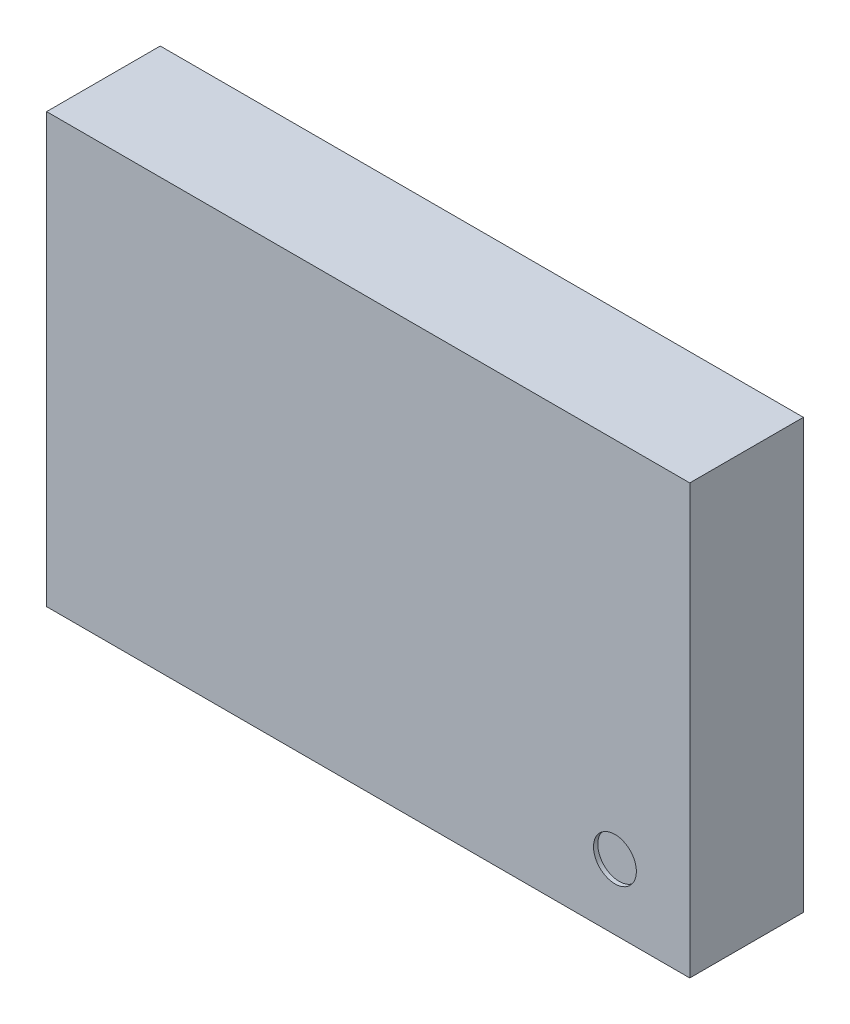
ISO-10303-21;
HEADER;
FILE_DESCRIPTION(('STEP AP214'),'2;1');
FILE_NAME('part.step','',(''),(''),'','','');
FILE_SCHEMA(('AUTOMOTIVE_DESIGN { 1 0 10303 214 1 1 1 1 }'));
ENDSEC;
DATA;
#1=APPLICATION_CONTEXT('core data for automotive mechanical design processes');
#2=APPLICATION_PROTOCOL_DEFINITION('international standard','automotive_design',2000,#1);
#3=PRODUCT_CONTEXT('',#1,'mechanical');
#4=PRODUCT('Part','Part','',(#3));
#5=PRODUCT_RELATED_PRODUCT_CATEGORY('part','',(#4));
#6=PRODUCT_DEFINITION_FORMATION('','',#4);
#7=PRODUCT_DEFINITION_CONTEXT('part definition',#1,'design');
#8=PRODUCT_DEFINITION('design','',#6,#7);
#9=PRODUCT_DEFINITION_SHAPE('','',#8);
#10=(LENGTH_UNIT() NAMED_UNIT(*) SI_UNIT(.MILLI.,.METRE.));
#11=(NAMED_UNIT(*) PLANE_ANGLE_UNIT() SI_UNIT($,.RADIAN.));
#12=(NAMED_UNIT(*) SI_UNIT($,.STERADIAN.) SOLID_ANGLE_UNIT());
#13=UNCERTAINTY_MEASURE_WITH_UNIT(LENGTH_MEASURE(1.E-05),#10,'distance_accuracy_value','');
#14=(GEOMETRIC_REPRESENTATION_CONTEXT(3) GLOBAL_UNCERTAINTY_ASSIGNED_CONTEXT((#13)) GLOBAL_UNIT_ASSIGNED_CONTEXT((#10,
#11,#12)) REPRESENTATION_CONTEXT('',''));
#15=CARTESIAN_POINT('',(0.,0.,0.));
#16=DIRECTION('',(0.,0.,1.));
#17=DIRECTION('',(1.,0.,0.));
#18=AXIS2_PLACEMENT_3D('',#15,#16,#17);
#19=CARTESIAN_POINT('',(1.150966,-0.694305,0.51));
#20=DIRECTION('',(0.,0.,1.));
#21=DIRECTION('',(1.,0.,0.));
#22=AXIS2_PLACEMENT_3D('',#19,#20,#21);
#23=PLANE('',#22);
#24=CARTESIAN_POINT('',(1.150966,-0.694305,0.51));
#25=DIRECTION('',(0.,0.,1.));
#26=DIRECTION('',(1.,0.,0.));
#27=AXIS2_PLACEMENT_3D('',#24,#25,#26);
#28=CIRCLE('',#27,0.1);
#29=CARTESIAN_POINT('',(1.050966,-0.694305,0.51));
#30=VERTEX_POINT('',#29);
#31=EDGE_CURVE('E25',#30,#30,#28,.T.);
#32=ORIENTED_EDGE('',*,*,#31,.T.);
#33=EDGE_LOOP('',(#32));
#34=FACE_BOUND('',#33,.T.);
#35=ADVANCED_FACE('F17',(#34),#23,.T.);
#36=CARTESIAN_POINT('',(1.150966,-0.694305,0.53));
#37=DIRECTION('',(0.,0.,1.));
#38=DIRECTION('',(1.,0.,0.));
#39=AXIS2_PLACEMENT_3D('',#36,#37,#38);
#40=CYLINDRICAL_SURFACE('',#39,0.1);
#41=ORIENTED_EDGE('',*,*,#31,.F.);
#42=DIRECTION('',(0.,0.,1.));
#43=VECTOR('',#42,1.);
#44=CARTESIAN_POINT('',(1.050966,-0.694305,0.53));
#45=LINE('',#44,#43);
#46=CARTESIAN_POINT('',(1.050966,-0.694305,0.53));
#47=VERTEX_POINT('',#46);
#48=EDGE_CURVE('E11',#30,#47,#45,.T.);
#49=ORIENTED_EDGE('',*,*,#48,.T.);
#50=CARTESIAN_POINT('',(1.150966,-0.694305,0.53));
#51=DIRECTION('',(0.,0.,1.));
#52=DIRECTION('',(1.,0.,0.));
#53=AXIS2_PLACEMENT_3D('',#50,#51,#52);
#54=CIRCLE('',#53,0.1);
#55=EDGE_CURVE('E120',#47,#47,#54,.T.);
#56=ORIENTED_EDGE('',*,*,#55,.T.);
#57=ORIENTED_EDGE('',*,*,#48,.F.);
#58=EDGE_LOOP('',(#41,#49,#56,#57));
#59=FACE_BOUND('',#58,.T.);
#60=ADVANCED_FACE('F136',(#59),#40,.F.);
#61=CARTESIAN_POINT('',(1.5,-1.,0.));
#62=DIRECTION('',(-1.,0.,0.));
#63=DIRECTION('',(0.,0.,1.));
#64=AXIS2_PLACEMENT_3D('',#61,#62,#63);
#65=PLANE('',#64);
#66=DIRECTION('',(0.,0.,1.));
#67=VECTOR('',#66,1.);
#68=CARTESIAN_POINT('',(1.5,-1.,0.));
#69=LINE('',#68,#67);
#70=CARTESIAN_POINT('',(1.5,-1.,0.));
#71=VERTEX_POINT('',#70);
#72=CARTESIAN_POINT('',(1.5,-1.,0.53));
#73=VERTEX_POINT('',#72);
#74=EDGE_CURVE('E127',#71,#73,#69,.T.);
#75=ORIENTED_EDGE('',*,*,#74,.F.);
#76=DIRECTION('',(0.,1.,0.));
#77=VECTOR('',#76,1.);
#78=CARTESIAN_POINT('',(1.5,-1.,0.));
#79=LINE('',#78,#77);
#80=CARTESIAN_POINT('',(1.5,1.,0.));
#81=VERTEX_POINT('',#80);
#82=EDGE_CURVE('E113',#71,#81,#79,.T.);
#83=ORIENTED_EDGE('',*,*,#82,.T.);
#84=DIRECTION('',(0.,0.,1.));
#85=VECTOR('',#84,1.);
#86=CARTESIAN_POINT('',(1.5,1.,0.));
#87=LINE('',#86,#85);
#88=CARTESIAN_POINT('',(1.5,1.,0.53));
#89=VERTEX_POINT('',#88);
#90=EDGE_CURVE('E83',#81,#89,#87,.T.);
#91=ORIENTED_EDGE('',*,*,#90,.T.);
#92=DIRECTION('',(0.,1.,0.));
#93=VECTOR('',#92,1.);
#94=CARTESIAN_POINT('',(1.5,-1.,0.53));
#95=LINE('',#94,#93);
#96=EDGE_CURVE('E116',#73,#89,#95,.T.);
#97=ORIENTED_EDGE('',*,*,#96,.F.);
#98=EDGE_LOOP('',(#75,#83,#91,#97));
#99=FACE_BOUND('',#98,.T.);
#100=ADVANCED_FACE('F138',(#99),#65,.F.);
#101=CARTESIAN_POINT('',(0.,0.,0.53));
#102=DIRECTION('',(0.,0.,1.));
#103=DIRECTION('',(1.,0.,0.));
#104=AXIS2_PLACEMENT_3D('',#101,#102,#103);
#105=PLANE('',#104);
#106=ORIENTED_EDGE('',*,*,#55,.F.);
#107=EDGE_LOOP('',(#106));
#108=FACE_BOUND('',#107,.T.);
#109=DIRECTION('',(0.,-1.,0.));
#110=VECTOR('',#109,1.);
#111=CARTESIAN_POINT('',(-1.5,1.,0.53));
#112=LINE('',#111,#110);
#113=CARTESIAN_POINT('',(-1.5,1.,0.53));
#114=VERTEX_POINT('',#113);
#115=CARTESIAN_POINT('',(-1.5,-1.,0.53));
#116=VERTEX_POINT('',#115);
#117=EDGE_CURVE('E102',#114,#116,#112,.T.);
#118=ORIENTED_EDGE('',*,*,#117,.T.);
#119=DIRECTION('',(1.,0.,0.));
#120=VECTOR('',#119,1.);
#121=CARTESIAN_POINT('',(-1.5,-1.,0.53));
#122=LINE('',#121,#120);
#123=EDGE_CURVE('E117',#116,#73,#122,.T.);
#124=ORIENTED_EDGE('',*,*,#123,.T.);
#125=ORIENTED_EDGE('',*,*,#96,.T.);
#126=DIRECTION('',(-1.,0.,0.));
#127=VECTOR('',#126,1.);
#128=CARTESIAN_POINT('',(1.5,1.,0.53));
#129=LINE('',#128,#127);
#130=EDGE_CURVE('E86',#89,#114,#129,.T.);
#131=ORIENTED_EDGE('',*,*,#130,.T.);
#132=EDGE_LOOP('',(#118,#124,#125,#131));
#133=FACE_BOUND('',#132,.T.);
#134=ADVANCED_FACE('F144',(#108,#133),#105,.T.);
#135=CARTESIAN_POINT('',(0.,0.,0.));
#136=DIRECTION('',(0.,0.,1.));
#137=DIRECTION('',(1.,0.,0.));
#138=AXIS2_PLACEMENT_3D('',#135,#136,#137);
#139=PLANE('',#138);
#140=DIRECTION('',(0.,-1.,0.));
#141=VECTOR('',#140,1.);
#142=CARTESIAN_POINT('',(-1.5,1.,0.));
#143=LINE('',#142,#141);
#144=CARTESIAN_POINT('',(-1.5,1.,0.));
#145=VERTEX_POINT('',#144);
#146=CARTESIAN_POINT('',(-1.5,-1.,0.));
#147=VERTEX_POINT('',#146);
#148=EDGE_CURVE('E89',#145,#147,#143,.T.);
#149=ORIENTED_EDGE('',*,*,#148,.F.);
#150=DIRECTION('',(-1.,0.,0.));
#151=VECTOR('',#150,1.);
#152=CARTESIAN_POINT('',(1.5,1.,0.));
#153=LINE('',#152,#151);
#154=EDGE_CURVE('E76',#81,#145,#153,.T.);
#155=ORIENTED_EDGE('',*,*,#154,.F.);
#156=ORIENTED_EDGE('',*,*,#82,.F.);
#157=DIRECTION('',(1.,0.,0.));
#158=VECTOR('',#157,1.);
#159=CARTESIAN_POINT('',(-1.5,-1.,0.));
#160=LINE('',#159,#158);
#161=EDGE_CURVE('E92',#147,#71,#160,.T.);
#162=ORIENTED_EDGE('',*,*,#161,.F.);
#163=EDGE_LOOP('',(#149,#155,#156,#162));
#164=FACE_BOUND('',#163,.T.);
#165=ADVANCED_FACE('F90',(#164),#139,.F.);
#166=CARTESIAN_POINT('',(-1.5,-1.,0.));
#167=DIRECTION('',(0.,1.,0.));
#168=DIRECTION('',(1.,0.,0.));
#169=AXIS2_PLACEMENT_3D('',#166,#167,#168);
#170=PLANE('',#169);
#171=DIRECTION('',(0.,0.,1.));
#172=VECTOR('',#171,1.);
#173=CARTESIAN_POINT('',(-1.5,-1.,0.));
#174=LINE('',#173,#172);
#175=EDGE_CURVE('E97',#147,#116,#174,.T.);
#176=ORIENTED_EDGE('',*,*,#175,.F.);
#177=ORIENTED_EDGE('',*,*,#161,.T.);
#178=ORIENTED_EDGE('',*,*,#74,.T.);
#179=ORIENTED_EDGE('',*,*,#123,.F.);
#180=EDGE_LOOP('',(#176,#177,#178,#179));
#181=FACE_BOUND('',#180,.T.);
#182=ADVANCED_FACE('F153',(#181),#170,.F.);
#183=CARTESIAN_POINT('',(1.5,1.,0.));
#184=DIRECTION('',(0.,-1.,0.));
#185=DIRECTION('',(0.,0.,-1.));
#186=AXIS2_PLACEMENT_3D('',#183,#184,#185);
#187=PLANE('',#186);
#188=ORIENTED_EDGE('',*,*,#90,.F.);
#189=ORIENTED_EDGE('',*,*,#154,.T.);
#190=DIRECTION('',(0.,0.,1.));
#191=VECTOR('',#190,1.);
#192=CARTESIAN_POINT('',(-1.5,1.,0.));
#193=LINE('',#192,#191);
#194=EDGE_CURVE('E81',#145,#114,#193,.T.);
#195=ORIENTED_EDGE('',*,*,#194,.T.);
#196=ORIENTED_EDGE('',*,*,#130,.F.);
#197=EDGE_LOOP('',(#188,#189,#195,#196));
#198=FACE_BOUND('',#197,.T.);
#199=ADVANCED_FACE('F78',(#198),#187,.F.);
#200=CARTESIAN_POINT('',(-1.5,1.,0.));
#201=DIRECTION('',(1.,0.,0.));
#202=DIRECTION('',(0.,1.,0.));
#203=AXIS2_PLACEMENT_3D('',#200,#201,#202);
#204=PLANE('',#203);
#205=ORIENTED_EDGE('',*,*,#194,.F.);
#206=ORIENTED_EDGE('',*,*,#148,.T.);
#207=ORIENTED_EDGE('',*,*,#175,.T.);
#208=ORIENTED_EDGE('',*,*,#117,.F.);
#209=EDGE_LOOP('',(#205,#206,#207,#208));
#210=FACE_BOUND('',#209,.T.);
#211=ADVANCED_FACE('F100',(#210),#204,.F.);
#212=CLOSED_SHELL('',(#35,#60,#100,#134,#165,#182,#199,#211));
#213=MANIFOLD_SOLID_BREP('B1',#212);
#214=ADVANCED_BREP_SHAPE_REPRESENTATION('',(#18,#213),#14);
#215=SHAPE_DEFINITION_REPRESENTATION(#9,#214);
ENDSEC;
END-ISO-10303-21;
